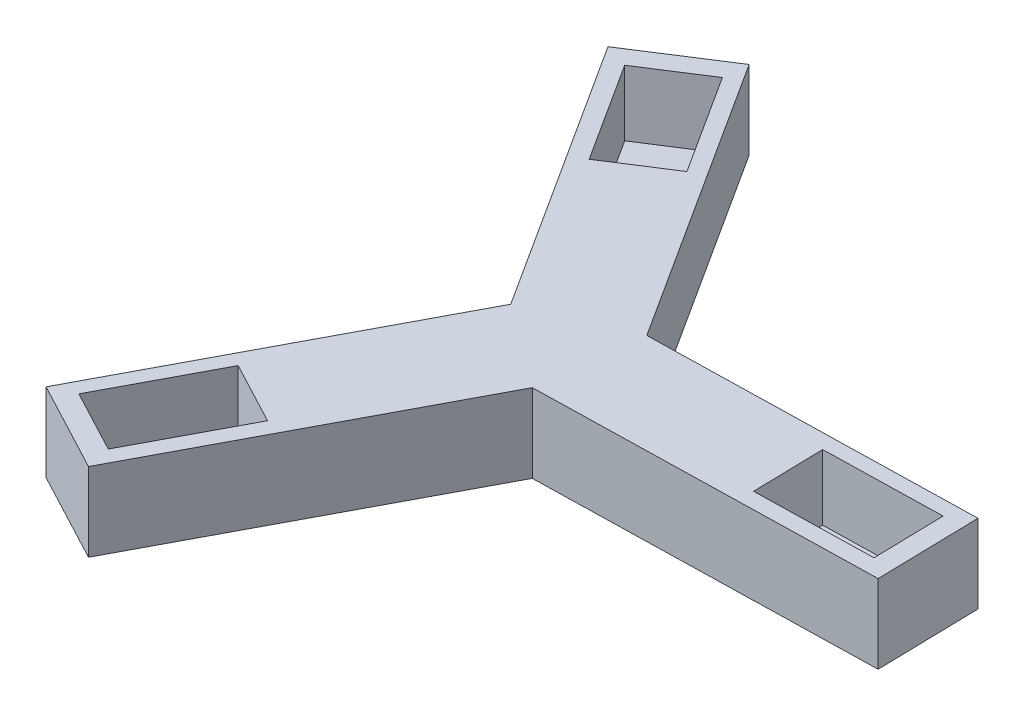
ISO-10303-21;
HEADER;
FILE_DESCRIPTION(('STEP AP214'),'2;1');
FILE_NAME('part.step','',(''),(''),'','','');
FILE_SCHEMA(('AUTOMOTIVE_DESIGN { 1 0 10303 214 1 1 1 1 }'));
ENDSEC;
DATA;
#1=APPLICATION_CONTEXT('core data for automotive mechanical design processes');
#2=APPLICATION_PROTOCOL_DEFINITION('international standard','automotive_design',2000,#1);
#3=PRODUCT_CONTEXT('',#1,'mechanical');
#4=PRODUCT('Part','Part','',(#3));
#5=PRODUCT_RELATED_PRODUCT_CATEGORY('part','',(#4));
#6=PRODUCT_DEFINITION_FORMATION('','',#4);
#7=PRODUCT_DEFINITION_CONTEXT('part definition',#1,'design');
#8=PRODUCT_DEFINITION('design','',#6,#7);
#9=PRODUCT_DEFINITION_SHAPE('','',#8);
#10=(LENGTH_UNIT() NAMED_UNIT(*) SI_UNIT(.MILLI.,.METRE.));
#11=(NAMED_UNIT(*) PLANE_ANGLE_UNIT() SI_UNIT($,.RADIAN.));
#12=(NAMED_UNIT(*) SI_UNIT($,.STERADIAN.) SOLID_ANGLE_UNIT());
#13=UNCERTAINTY_MEASURE_WITH_UNIT(LENGTH_MEASURE(1.E-05),#10,'distance_accuracy_value','');
#14=(GEOMETRIC_REPRESENTATION_CONTEXT(3) GLOBAL_UNCERTAINTY_ASSIGNED_CONTEXT((#13)) GLOBAL_UNIT_ASSIGNED_CONTEXT((#10,
#11,#12)) REPRESENTATION_CONTEXT('',''));
#15=CARTESIAN_POINT('',(0.,0.,0.));
#16=DIRECTION('',(0.,0.,1.));
#17=DIRECTION('',(1.,0.,0.));
#18=AXIS2_PLACEMENT_3D('',#15,#16,#17);
#19=CARTESIAN_POINT('',(-6.99882962270384,40.,4.49327331888505));
#20=DIRECTION('',(-0.841505066709778,0.,0.540249222768318));
#21=DIRECTION('',(0.540249222768318,0.,0.841505066709778));
#22=AXIS2_PLACEMENT_3D('',#19,#20,#21);
#23=PLANE('',#22);
#24=DIRECTION('',(-0.540249222768318,0.,-0.841505066709778));
#25=VECTOR('',#24,1.);
#26=CARTESIAN_POINT('',(-6.99882962270384,15.,4.49327331888505));
#27=LINE('',#26,#25);
#28=CARTESIAN_POINT('',(-29.7803936200412,15.,-30.9918337824235));
#29=VERTEX_POINT('',#28);
#30=CARTESIAN_POINT('',(-54.0916086446155,15.,-68.8595617843635));
#31=VERTEX_POINT('',#30);
#32=EDGE_CURVE('E61',#29,#31,#27,.T.);
#33=ORIENTED_EDGE('',*,*,#32,.F.);
#34=DIRECTION('',(0.,-1.,0.));
#35=VECTOR('',#34,1.);
#36=CARTESIAN_POINT('',(-29.7803936200412,40.,-30.9918337824235));
#37=LINE('',#36,#35);
#38=CARTESIAN_POINT('',(-29.7803936200412,40.,-30.9918337824235));
#39=VERTEX_POINT('',#38);
#40=EDGE_CURVE('E11',#39,#29,#37,.T.);
#41=ORIENTED_EDGE('',*,*,#40,.F.);
#42=DIRECTION('',(-0.540249222768318,0.,-0.841505066709778));
#43=VECTOR('',#42,1.);
#44=CARTESIAN_POINT('',(-6.99882962270384,40.,4.49327331888505));
#45=LINE('',#44,#43);
#46=CARTESIAN_POINT('',(-54.0916086446155,40.,-68.8595617843635));
#47=VERTEX_POINT('',#46);
#48=EDGE_CURVE('E289',#39,#47,#45,.T.);
#49=ORIENTED_EDGE('',*,*,#48,.T.);
#50=DIRECTION('',(0.,-1.,0.));
#51=VECTOR('',#50,1.);
#52=CARTESIAN_POINT('',(-54.0916086446155,40.,-68.8595617843635));
#53=LINE('',#52,#51);
#54=EDGE_CURVE('E247',#47,#31,#53,.T.);
#55=ORIENTED_EDGE('',*,*,#54,.T.);
#56=EDGE_LOOP('',(#33,#41,#49,#55));
#57=FACE_BOUND('',#56,.T.);
#58=ADVANCED_FACE('F36',(#57),#23,.T.);
#59=CARTESIAN_POINT('',(-22.7815639973374,40.,-35.4851071013085));
#60=DIRECTION('',(-0.540249222768318,0.,-0.841505066709778));
#61=DIRECTION('',(-0.841505066709778,0.,0.540249222768318));
#62=AXIS2_PLACEMENT_3D('',#59,#60,#61);
#63=PLANE('',#62);
#64=DIRECTION('',(0.841505066709778,0.,-0.540249222768318));
#65=VECTOR('',#64,1.);
#66=CARTESIAN_POINT('',(-22.7815639973374,15.,-35.4851071013085));
#67=LINE('',#66,#65);
#68=CARTESIAN_POINT('',(-52.5010304212052,15.,-16.4051047676789));
#69=VERTEX_POINT('',#68);
#70=EDGE_CURVE('E348',#69,#29,#67,.T.);
#71=ORIENTED_EDGE('',*,*,#70,.F.);
#72=DIRECTION('',(0.,-1.,0.));
#73=VECTOR('',#72,1.);
#74=CARTESIAN_POINT('',(-52.5010304212052,40.,-16.4051047676789));
#75=LINE('',#74,#73);
#76=CARTESIAN_POINT('',(-52.5010304212052,40.,-16.4051047676789));
#77=VERTEX_POINT('',#76);
#78=EDGE_CURVE('E45',#77,#69,#75,.T.);
#79=ORIENTED_EDGE('',*,*,#78,.F.);
#80=DIRECTION('',(0.841505066709778,0.,-0.540249222768318));
#81=VECTOR('',#80,1.);
#82=CARTESIAN_POINT('',(-22.7815639973374,40.,-35.4851071013085));
#83=LINE('',#82,#81);
#84=EDGE_CURVE('E286',#77,#39,#83,.T.);
#85=ORIENTED_EDGE('',*,*,#84,.T.);
#86=ORIENTED_EDGE('',*,*,#40,.T.);
#87=EDGE_LOOP('',(#71,#79,#85,#86));
#88=FACE_BOUND('',#87,.T.);
#89=ADVANCED_FACE('F374',(#88),#63,.T.);
#90=CARTESIAN_POINT('',(-29.7194664238679,40.,19.0800023336297));
#91=DIRECTION('',(-0.841505066709778,0.,0.540249222768318));
#92=DIRECTION('',(0.540249222768318,0.,0.841505066709778));
#93=AXIS2_PLACEMENT_3D('',#90,#91,#92);
#94=PLANE('',#93);
#95=ORIENTED_EDGE('',*,*,#78,.T.);
#96=DIRECTION('',(-0.540249222768318,0.,-0.841505066709778));
#97=VECTOR('',#96,1.);
#98=CARTESIAN_POINT('',(-29.7194664238679,15.,19.0800023336297));
#99=LINE('',#98,#97);
#100=CARTESIAN_POINT('',(-76.8122454457796,15.,-54.2728327696189));
#101=VERTEX_POINT('',#100);
#102=EDGE_CURVE('E342',#69,#101,#99,.T.);
#103=ORIENTED_EDGE('',*,*,#102,.T.);
#104=DIRECTION('',(0.,-1.,0.));
#105=VECTOR('',#104,1.);
#106=CARTESIAN_POINT('',(-76.8122454457796,40.,-54.2728327696189));
#107=LINE('',#106,#105);
#108=CARTESIAN_POINT('',(-76.8122454457796,40.,-54.2728327696189));
#109=VERTEX_POINT('',#108);
#110=EDGE_CURVE('E255',#109,#101,#107,.T.);
#111=ORIENTED_EDGE('',*,*,#110,.F.);
#112=DIRECTION('',(-0.540249222768318,0.,-0.841505066709778));
#113=VECTOR('',#112,1.);
#114=CARTESIAN_POINT('',(-29.7194664238679,40.,19.0800023336297));
#115=LINE('',#114,#113);
#116=EDGE_CURVE('E283',#77,#109,#115,.T.);
#117=ORIENTED_EDGE('',*,*,#116,.F.);
#118=EDGE_LOOP('',(#95,#103,#111,#117));
#119=FACE_BOUND('',#118,.T.);
#120=ADVANCED_FACE('F378',(#119),#94,.F.);
#121=CARTESIAN_POINT('',(9.04278221830663,40.,4.7851629635476));
#122=DIRECTION('',(0.883876510930576,0.,0.46772033676674));
#123=DIRECTION('',(0.46772033676674,0.,-0.883876510930576));
#124=AXIS2_PLACEMENT_3D('',#121,#122,#123);
#125=PLANE('',#124);
#126=DIRECTION('',(-0.46772033676674,0.,0.883876510930576));
#127=VECTOR('',#126,1.);
#128=CARTESIAN_POINT('',(9.04278221830663,15.,4.7851629635476));
#129=LINE('',#128,#127);
#130=CARTESIAN_POINT('',(-51.3043288347555,15.,118.826374707825));
#131=VERTEX_POINT('',#130);
#132=CARTESIAN_POINT('',(-72.3517439892587,15.,158.600817699701));
#133=VERTEX_POINT('',#132);
#134=EDGE_CURVE('E338',#131,#133,#129,.T.);
#135=ORIENTED_EDGE('',*,*,#134,.F.);
#136=DIRECTION('',(0.,-1.,0.));
#137=VECTOR('',#136,1.);
#138=CARTESIAN_POINT('',(-51.3043288347555,40.,118.826374707825));
#139=LINE('',#138,#137);
#140=CARTESIAN_POINT('',(-51.3043288347555,40.,118.826374707825));
#141=VERTEX_POINT('',#140);
#142=EDGE_CURVE('E244',#141,#131,#139,.T.);
#143=ORIENTED_EDGE('',*,*,#142,.F.);
#144=DIRECTION('',(-0.46772033676674,0.,0.883876510930576));
#145=VECTOR('',#144,1.);
#146=CARTESIAN_POINT('',(9.04278221830663,40.,4.7851629635476));
#147=LINE('',#146,#145);
#148=CARTESIAN_POINT('',(-72.3517439892587,40.,158.600817699701));
#149=VERTEX_POINT('',#148);
#150=EDGE_CURVE('E300',#141,#149,#147,.T.);
#151=ORIENTED_EDGE('',*,*,#150,.T.);
#152=DIRECTION('',(0.,-1.,0.));
#153=VECTOR('',#152,1.);
#154=CARTESIAN_POINT('',(-72.3517439892587,40.,158.600817699701));
#155=LINE('',#154,#153);
#156=EDGE_CURVE('E201',#149,#133,#155,.T.);
#157=ORIENTED_EDGE('',*,*,#156,.T.);
#158=EDGE_LOOP('',(#135,#143,#151,#157));
#159=FACE_BOUND('',#158,.T.);
#160=ADVANCED_FACE('F400',(#159),#125,.T.);
#161=CARTESIAN_POINT('',(-60.347111053062,40.,114.041211744277));
#162=DIRECTION('',(-0.467720336766739,0.,0.883876510930576));
#163=DIRECTION('',(0.883876510930576,0.,0.467720336766739));
#164=AXIS2_PLACEMENT_3D('',#161,#162,#163);
#165=PLANE('',#164);
#166=DIRECTION('',(-0.883876510930576,0.,-0.467720336766739));
#167=VECTOR('',#166,1.);
#168=CARTESIAN_POINT('',(-60.347111053062,15.,114.041211744277));
#169=LINE('',#168,#167);
#170=CARTESIAN_POINT('',(-27.4396630396299,15.,131.454823800527));
#171=VERTEX_POINT('',#170);
#172=EDGE_CURVE('E340',#171,#131,#169,.T.);
#173=ORIENTED_EDGE('',*,*,#172,.F.);
#174=DIRECTION('',(0.,-1.,0.));
#175=VECTOR('',#174,1.);
#176=CARTESIAN_POINT('',(-27.4396630396299,40.,131.454823800527));
#177=LINE('',#176,#175);
#178=CARTESIAN_POINT('',(-27.4396630396299,40.,131.454823800527));
#179=VERTEX_POINT('',#178);
#180=EDGE_CURVE('E248',#179,#171,#177,.T.);
#181=ORIENTED_EDGE('',*,*,#180,.F.);
#182=DIRECTION('',(-0.883876510930576,0.,-0.467720336766739));
#183=VECTOR('',#182,1.);
#184=CARTESIAN_POINT('',(-60.347111053062,40.,114.041211744277));
#185=LINE('',#184,#183);
#186=EDGE_CURVE('E297',#179,#141,#185,.T.);
#187=ORIENTED_EDGE('',*,*,#186,.T.);
#188=ORIENTED_EDGE('',*,*,#142,.T.);
#189=EDGE_LOOP('',(#173,#181,#187,#188));
#190=FACE_BOUND('',#189,.T.);
#191=ADVANCED_FACE('F396',(#190),#165,.T.);
#192=CARTESIAN_POINT('',(32.9074480134321,40.,17.4136120562495));
#193=DIRECTION('',(0.883876510930576,0.,0.467720336766739));
#194=DIRECTION('',(0.467720336766739,0.,-0.883876510930576));
#195=AXIS2_PLACEMENT_3D('',#192,#193,#194);
#196=PLANE('',#195);
#197=ORIENTED_EDGE('',*,*,#180,.T.);
#198=DIRECTION('',(-0.467720336766739,0.,0.883876510930576));
#199=VECTOR('',#198,1.);
#200=CARTESIAN_POINT('',(32.9074480134321,15.,17.4136120562495));
#201=LINE('',#200,#199);
#202=CARTESIAN_POINT('',(-48.4870781941332,15.,171.229266792403));
#203=VERTEX_POINT('',#202);
#204=EDGE_CURVE('E281',#171,#203,#201,.T.);
#205=ORIENTED_EDGE('',*,*,#204,.T.);
#206=DIRECTION('',(0.,-1.,0.));
#207=VECTOR('',#206,1.);
#208=CARTESIAN_POINT('',(-48.4870781941332,40.,171.229266792403));
#209=LINE('',#208,#207);
#210=CARTESIAN_POINT('',(-48.4870781941332,40.,171.229266792403));
#211=VERTEX_POINT('',#210);
#212=EDGE_CURVE('E205',#211,#203,#209,.T.);
#213=ORIENTED_EDGE('',*,*,#212,.F.);
#214=DIRECTION('',(-0.467720336766739,0.,0.883876510930576));
#215=VECTOR('',#214,1.);
#216=CARTESIAN_POINT('',(32.9074480134321,40.,17.4136120562495));
#217=LINE('',#216,#215);
#218=EDGE_CURVE('E294',#179,#211,#217,.T.);
#219=ORIENTED_EDGE('',*,*,#218,.F.);
#220=EDGE_LOOP('',(#197,#205,#213,#219));
#221=FACE_BOUND('',#220,.T.);
#222=ADVANCED_FACE('F393',(#221),#196,.F.);
#223=CARTESIAN_POINT('',(1.43920245325997,40.,63.9737406827199));
#224=DIRECTION('',(-0.0224910780984678,0.,-0.999747043709542));
#225=DIRECTION('',(-0.999747043709542,0.,0.0224910780984678));
#226=AXIS2_PLACEMENT_3D('',#223,#224,#225);
#227=PLANE('',#226);
#228=DIRECTION('',(0.999747043709542,0.,-0.0224910780984678));
#229=VECTOR('',#228,1.);
#230=CARTESIAN_POINT('',(1.43920245325997,15.,63.9737406827199));
#231=LINE('',#230,#229);
#232=CARTESIAN_POINT('',(88.664625708562,15.,62.0114505024681));
#233=VERTEX_POINT('',#232);
#234=CARTESIAN_POINT('',(133.653242675491,15.,60.9993519880371));
#235=VERTEX_POINT('',#234);
#236=EDGE_CURVE('E53',#233,#235,#231,.T.);
#237=ORIENTED_EDGE('',*,*,#236,.F.);
#238=DIRECTION('',(0.,-1.,0.));
#239=VECTOR('',#238,1.);
#240=CARTESIAN_POINT('',(88.664625708562,40.,62.0114505024681));
#241=LINE('',#240,#239);
#242=CARTESIAN_POINT('',(88.664625708562,40.,62.0114505024681));
#243=VERTEX_POINT('',#242);
#244=EDGE_CURVE('E191',#243,#233,#241,.T.);
#245=ORIENTED_EDGE('',*,*,#244,.F.);
#246=DIRECTION('',(0.999747043709542,0.,-0.0224910780984678));
#247=VECTOR('',#246,1.);
#248=CARTESIAN_POINT('',(1.43920245325997,40.,63.9737406827199));
#249=LINE('',#248,#247);
#250=CARTESIAN_POINT('',(133.653242675491,40.,60.9993519880371));
#251=VERTEX_POINT('',#250);
#252=EDGE_CURVE('E309',#243,#251,#249,.T.);
#253=ORIENTED_EDGE('',*,*,#252,.T.);
#254=DIRECTION('',(0.,-1.,0.));
#255=VECTOR('',#254,1.);
#256=CARTESIAN_POINT('',(133.653242675491,40.,60.9993519880371));
#257=LINE('',#256,#255);
#258=EDGE_CURVE('E194',#251,#235,#257,.T.);
#259=ORIENTED_EDGE('',*,*,#258,.T.);
#260=EDGE_LOOP('',(#237,#245,#253,#259));
#261=FACE_BOUND('',#260,.T.);
#262=ADVANCED_FACE('F189',(#261),#227,.T.);
#263=CARTESIAN_POINT('',(87.225423255302,40.,-1.96229018025168));
#264=DIRECTION('',(0.999747043709542,0.,-0.0224910780984675));
#265=DIRECTION('',(-0.0224910780984675,0.,-0.999747043709542));
#266=AXIS2_PLACEMENT_3D('',#263,#264,#265);
#267=PLANE('',#266);
#268=DIRECTION('',(0.0224910780984675,0.,0.999747043709542));
#269=VECTOR('',#268,1.);
#270=CARTESIAN_POINT('',(87.225423255302,15.,-1.96229018025168));
#271=LINE('',#270,#269);
#272=CARTESIAN_POINT('',(88.0573665999033,15.,35.0182803223105));
#273=VERTEX_POINT('',#272);
#274=EDGE_CURVE('E179',#273,#233,#271,.T.);
#275=ORIENTED_EDGE('',*,*,#274,.F.);
#276=DIRECTION('',(0.,-1.,0.));
#277=VECTOR('',#276,1.);
#278=CARTESIAN_POINT('',(88.0573665999033,40.,35.0182803223105));
#279=LINE('',#278,#277);
#280=CARTESIAN_POINT('',(88.0573665999033,40.,35.0182803223105));
#281=VERTEX_POINT('',#280);
#282=EDGE_CURVE('E202',#281,#273,#279,.T.);
#283=ORIENTED_EDGE('',*,*,#282,.F.);
#284=DIRECTION('',(0.0224910780984675,0.,0.999747043709542));
#285=VECTOR('',#284,1.);
#286=CARTESIAN_POINT('',(87.225423255302,40.,-1.96229018025168));
#287=LINE('',#286,#285);
#288=EDGE_CURVE('E200',#281,#243,#287,.T.);
#289=ORIENTED_EDGE('',*,*,#288,.T.);
#290=ORIENTED_EDGE('',*,*,#244,.T.);
#291=EDGE_LOOP('',(#275,#283,#289,#290));
#292=FACE_BOUND('',#291,.T.);
#293=ADVANCED_FACE('F198',(#292),#267,.T.);
#294=CARTESIAN_POINT('',(0.831943344601324,40.,36.9805705025622));
#295=DIRECTION('',(-0.0224910780984673,0.,-0.999747043709542));
#296=DIRECTION('',(-0.999747043709542,0.,0.0224910780984673));
#297=AXIS2_PLACEMENT_3D('',#294,#295,#296);
#298=PLANE('',#297);
#299=ORIENTED_EDGE('',*,*,#282,.T.);
#300=DIRECTION('',(0.999747043709542,0.,-0.0224910780984673));
#301=VECTOR('',#300,1.);
#302=CARTESIAN_POINT('',(0.831943344601324,15.,36.9805705025622));
#303=LINE('',#302,#301);
#304=CARTESIAN_POINT('',(133.045983566833,15.,34.0061818078795));
#305=VERTEX_POINT('',#304);
#306=EDGE_CURVE('E182',#273,#305,#303,.T.);
#307=ORIENTED_EDGE('',*,*,#306,.T.);
#308=DIRECTION('',(0.,-1.,0.));
#309=VECTOR('',#308,1.);
#310=CARTESIAN_POINT('',(133.045983566833,40.,34.0061818078795));
#311=LINE('',#310,#309);
#312=CARTESIAN_POINT('',(133.045983566833,40.,34.0061818078795));
#313=VERTEX_POINT('',#312);
#314=EDGE_CURVE('E207',#313,#305,#311,.T.);
#315=ORIENTED_EDGE('',*,*,#314,.F.);
#316=DIRECTION('',(0.999747043709542,0.,-0.0224910780984673));
#317=VECTOR('',#316,1.);
#318=CARTESIAN_POINT('',(0.831943344601324,40.,36.9805705025622));
#319=LINE('',#318,#317);
#320=EDGE_CURVE('E305',#281,#313,#319,.T.);
#321=ORIENTED_EDGE('',*,*,#320,.F.);
#322=EDGE_LOOP('',(#299,#307,#315,#321));
#323=FACE_BOUND('',#322,.T.);
#324=ADVANCED_FACE('F355',(#323),#298,.F.);
#325=CARTESIAN_POINT('',(0.702397708267025,40.,31.2221597059045));
#326=DIRECTION('',(-0.0224910780984673,0.,-0.999747043709542));
#327=DIRECTION('',(-0.999747043709542,0.,0.0224910780984673));
#328=AXIS2_PLACEMENT_3D('',#325,#326,#327);
#329=PLANE('',#328);
#330=DIRECTION('',(0.999747043709542,0.,-0.0224910780984673));
#331=VECTOR('',#330,1.);
#332=CARTESIAN_POINT('',(0.702397708267025,10.,31.2221597059045));
#333=LINE('',#332,#331);
#334=CARTESIAN_POINT('',(16.7622523157272,10.,30.860864869877));
#335=VERTEX_POINT('',#334);
#336=CARTESIAN_POINT('',(140.429718135747,10.,28.0787464835323));
#337=VERTEX_POINT('',#336);
#338=EDGE_CURVE('E279',#335,#337,#333,.T.);
#339=ORIENTED_EDGE('',*,*,#338,.F.);
#340=DIRECTION('',(0.,-1.,0.));
#341=VECTOR('',#340,1.);
#342=CARTESIAN_POINT('',(16.7622523157272,40.,30.860864869877));
#343=LINE('',#342,#341);
#344=CARTESIAN_POINT('',(16.7622523157272,40.,30.860864869877));
#345=VERTEX_POINT('',#344);
#346=EDGE_CURVE('E40',#345,#335,#343,.T.);
#347=ORIENTED_EDGE('',*,*,#346,.F.);
#348=DIRECTION('',(0.999747043709542,0.,-0.0224910780984673));
#349=VECTOR('',#348,1.);
#350=CARTESIAN_POINT('',(0.702397708267025,40.,31.2221597059045));
#351=LINE('',#350,#349);
#352=CARTESIAN_POINT('',(140.429718135747,40.,28.0787464835323));
#353=VERTEX_POINT('',#352);
#354=EDGE_CURVE('E262',#345,#353,#351,.T.);
#355=ORIENTED_EDGE('',*,*,#354,.T.);
#356=DIRECTION('',(0.,-1.,0.));
#357=VECTOR('',#356,1.);
#358=CARTESIAN_POINT('',(140.429718135747,40.,28.0787464835323));
#359=LINE('',#358,#357);
#360=EDGE_CURVE('E211',#353,#337,#359,.T.);
#361=ORIENTED_EDGE('',*,*,#360,.T.);
#362=EDGE_LOOP('',(#339,#347,#355,#361));
#363=FACE_BOUND('',#362,.T.);
#364=ADVANCED_FACE('F38',(#363),#329,.T.);
#365=CARTESIAN_POINT('',(-2.16017548912262,40.,1.38684028796723));
#366=DIRECTION('',(0.841505066709778,0.,-0.540249222768318));
#367=DIRECTION('',(-0.540249222768318,0.,-0.841505066709778));
#368=AXIS2_PLACEMENT_3D('',#365,#366,#367);
#369=PLANE('',#368);
#370=DIRECTION('',(0.540249222768318,0.,0.841505066709778));
#371=VECTOR('',#370,1.);
#372=CARTESIAN_POINT('',(-2.16017548912262,10.,1.38684028796723));
#373=LINE('',#372,#371);
#374=CARTESIAN_POINT('',(-53.3048236817967,10.,-78.2772828156047));
#375=VERTEX_POINT('',#374);
#376=EDGE_CURVE('E277',#375,#335,#373,.T.);
#377=ORIENTED_EDGE('',*,*,#376,.F.);
#378=DIRECTION('',(0.,-1.,0.));
#379=VECTOR('',#378,1.);
#380=CARTESIAN_POINT('',(-53.3048236817967,40.,-78.2772828156047));
#381=LINE('',#380,#379);
#382=CARTESIAN_POINT('',(-53.3048236817967,40.,-78.2772828156047));
#383=VERTEX_POINT('',#382);
#384=EDGE_CURVE('E232',#383,#375,#381,.T.);
#385=ORIENTED_EDGE('',*,*,#384,.F.);
#386=DIRECTION('',(0.540249222768318,0.,0.841505066709778));
#387=VECTOR('',#386,1.);
#388=CARTESIAN_POINT('',(-2.16017548912262,40.,1.38684028796723));
#389=LINE('',#388,#387);
#390=EDGE_CURVE('E329',#383,#345,#389,.T.);
#391=ORIENTED_EDGE('',*,*,#390,.T.);
#392=ORIENTED_EDGE('',*,*,#346,.T.);
#393=EDGE_LOOP('',(#377,#385,#391,#392));
#394=FACE_BOUND('',#393,.T.);
#395=ADVANCED_FACE('F438',(#394),#369,.T.);
#396=CARTESIAN_POINT('',(-51.1446481926741,40.,-79.6641231035719));
#397=DIRECTION('',(-0.540249222768318,0.,-0.841505066709778));
#398=DIRECTION('',(-0.841505066709778,0.,0.540249222768318));
#399=AXIS2_PLACEMENT_3D('',#396,#397,#398);
#400=PLANE('',#399);
#401=DIRECTION('',(0.841505066709778,0.,-0.540249222768318));
#402=VECTOR('',#401,1.);
#403=CARTESIAN_POINT('',(-51.1446481926741,10.,-79.6641231035719));
#404=LINE('',#403,#402);
#405=CARTESIAN_POINT('',(-86.1235212834775,10.,-57.2075631276402));
#406=VERTEX_POINT('',#405);
#407=EDGE_CURVE('E275',#406,#375,#404,.T.);
#408=ORIENTED_EDGE('',*,*,#407,.F.);
#409=DIRECTION('',(0.,-1.,0.));
#410=VECTOR('',#409,1.);
#411=CARTESIAN_POINT('',(-86.1235212834781,40.,-57.2075631276402));
#412=LINE('',#411,#410);
#413=CARTESIAN_POINT('',(-86.1235212834781,40.,-57.2075631276402));
#414=VERTEX_POINT('',#413);
#415=EDGE_CURVE('E230',#414,#406,#412,.T.);
#416=ORIENTED_EDGE('',*,*,#415,.F.);
#417=DIRECTION('',(0.841505066709778,0.,-0.540249222768318));
#418=VECTOR('',#417,1.);
#419=CARTESIAN_POINT('',(-51.1446481926741,40.,-79.6641231035719));
#420=LINE('',#419,#418);
#421=EDGE_CURVE('E327',#414,#383,#420,.T.);
#422=ORIENTED_EDGE('',*,*,#421,.T.);
#423=ORIENTED_EDGE('',*,*,#384,.T.);
#424=EDGE_LOOP('',(#408,#416,#422,#423));
#425=FACE_BOUND('',#424,.T.);
#426=ADVANCED_FACE('F435',(#425),#400,.T.);
#427=CARTESIAN_POINT('',(-34.9788730908044,40.,22.4565599759315));
#428=DIRECTION('',(0.841505066709782,0.,-0.540249222768312));
#429=DIRECTION('',(-0.540249222768312,0.,-0.841505066709782));
#430=AXIS2_PLACEMENT_3D('',#427,#428,#429);
#431=PLANE('',#430);
#432=DIRECTION('',(0.540249222768312,0.,0.841505066709782));
#433=VECTOR('',#432,1.);
#434=CARTESIAN_POINT('',(-34.9788730908044,10.,22.4565599759315));
#435=LINE('',#434,#433);
#436=CARTESIAN_POINT('',(-19.5395908979559,10.,46.5051539286819));
#437=VERTEX_POINT('',#436);
#438=EDGE_CURVE('E272',#406,#437,#435,.T.);
#439=ORIENTED_EDGE('',*,*,#438,.T.);
#440=DIRECTION('',(0.,-1.,0.));
#441=VECTOR('',#440,1.);
#442=CARTESIAN_POINT('',(-19.5395908979559,40.,46.5051539286819));
#443=LINE('',#442,#441);
#444=CARTESIAN_POINT('',(-19.5395908979559,40.,46.5051539286819));
#445=VERTEX_POINT('',#444);
#446=EDGE_CURVE('E227',#445,#437,#443,.T.);
#447=ORIENTED_EDGE('',*,*,#446,.F.);
#448=DIRECTION('',(0.540249222768312,0.,0.841505066709782));
#449=VECTOR('',#448,1.);
#450=CARTESIAN_POINT('',(-34.9788730908044,40.,22.4565599759315));
#451=LINE('',#450,#449);
#452=EDGE_CURVE('E325',#414,#445,#451,.T.);
#453=ORIENTED_EDGE('',*,*,#452,.F.);
#454=ORIENTED_EDGE('',*,*,#415,.T.);
#455=EDGE_LOOP('',(#439,#447,#453,#454));
#456=FACE_BOUND('',#455,.T.);
#457=ADVANCED_FACE('F431',(#456),#431,.F.);
#458=CARTESIAN_POINT('',(3.96049228045575,40.,2.0957710271388));
#459=DIRECTION('',(-0.883876510930576,0.,-0.467720336766739));
#460=DIRECTION('',(-0.467720336766739,0.,0.883876510930576));
#461=AXIS2_PLACEMENT_3D('',#458,#459,#460);
#462=PLANE('',#461);
#463=DIRECTION('',(0.467720336766739,0.,-0.883876510930576));
#464=VECTOR('',#463,1.);
#465=CARTESIAN_POINT('',(3.96049228045575,10.,2.0957710271388));
#466=LINE('',#465,#464);
#467=CARTESIAN_POINT('',(-80.9419364528601,10.,162.540499595272));
#468=VERTEX_POINT('',#467);
#469=EDGE_CURVE('E270',#468,#437,#466,.T.);
#470=ORIENTED_EDGE('',*,*,#469,.F.);
#471=DIRECTION('',(0.,-1.,0.));
#472=VECTOR('',#471,1.);
#473=CARTESIAN_POINT('',(-80.9419364528601,40.,162.540499595271));
#474=LINE('',#473,#472);
#475=CARTESIAN_POINT('',(-80.9419364528601,40.,162.540499595271));
#476=VERTEX_POINT('',#475);
#477=EDGE_CURVE('E224',#476,#468,#474,.T.);
#478=ORIENTED_EDGE('',*,*,#477,.F.);
#479=DIRECTION('',(0.467720336766739,0.,-0.883876510930576));
#480=VECTOR('',#479,1.);
#481=CARTESIAN_POINT('',(3.96049228045575,40.,2.0957710271388));
#482=LINE('',#481,#480);
#483=EDGE_CURVE('E322',#476,#445,#482,.T.);
#484=ORIENTED_EDGE('',*,*,#483,.T.);
#485=ORIENTED_EDGE('',*,*,#446,.T.);
#486=EDGE_LOOP('',(#470,#478,#484,#485));
#487=FACE_BOUND('',#486,.T.);
#488=ADVANCED_FACE('F427',(#487),#462,.T.);
#489=CARTESIAN_POINT('',(-84.9024287333158,40.,160.444728568133));
#490=DIRECTION('',(-0.467720336766739,0.,0.883876510930576));
#491=DIRECTION('',(0.883876510930576,0.,0.467720336766739));
#492=AXIS2_PLACEMENT_3D('',#489,#490,#491);
#493=PLANE('',#492);
#494=DIRECTION('',(-0.883876510930576,0.,-0.467720336766739));
#495=VECTOR('',#494,1.);
#496=CARTESIAN_POINT('',(-84.9024287333158,10.,160.444728568133));
#497=LINE('',#496,#495);
#498=CARTESIAN_POINT('',(-46.4707525265681,10.,180.781592729174));
#499=VERTEX_POINT('',#498);
#500=EDGE_CURVE('E268',#499,#468,#497,.T.);
#501=ORIENTED_EDGE('',*,*,#500,.F.);
#502=DIRECTION('',(0.,-1.,0.));
#503=VECTOR('',#502,1.);
#504=CARTESIAN_POINT('',(-46.4707525265676,40.,180.781592729174));
#505=LINE('',#504,#503);
#506=CARTESIAN_POINT('',(-46.4707525265676,40.,180.781592729174));
#507=VERTEX_POINT('',#506);
#508=EDGE_CURVE('E221',#507,#499,#505,.T.);
#509=ORIENTED_EDGE('',*,*,#508,.F.);
#510=DIRECTION('',(-0.883876510930576,0.,-0.467720336766739));
#511=VECTOR('',#510,1.);
#512=CARTESIAN_POINT('',(-84.9024287333158,40.,160.444728568133));
#513=LINE('',#512,#511);
#514=EDGE_CURVE('E319',#507,#476,#513,.T.);
#515=ORIENTED_EDGE('',*,*,#514,.T.);
#516=ORIENTED_EDGE('',*,*,#477,.T.);
#517=EDGE_LOOP('',(#501,#509,#515,#516));
#518=FACE_BOUND('',#517,.T.);
#519=ADVANCED_FACE('F423',(#518),#493,.T.);
#520=CARTESIAN_POINT('',(38.4316762067488,40.,20.3368641610423));
#521=DIRECTION('',(-0.883876510930572,0.,-0.467720336766746));
#522=DIRECTION('',(-0.467720336766746,0.,0.883876510930573));
#523=AXIS2_PLACEMENT_3D('',#520,#521,#522);
#524=PLANE('',#523);
#525=DIRECTION('',(0.467720336766746,0.,-0.883876510930572));
#526=VECTOR('',#525,1.);
#527=CARTESIAN_POINT('',(38.4316762067488,10.,20.3368641610423));
#528=LINE('',#527,#526);
#529=CARTESIAN_POINT('',(12.1598597463835,10.,69.9841419110722));
#530=VERTEX_POINT('',#529);
#531=EDGE_CURVE('E265',#499,#530,#528,.T.);
#532=ORIENTED_EDGE('',*,*,#531,.T.);
#533=DIRECTION('',(0.,-1.,0.));
#534=VECTOR('',#533,1.);
#535=CARTESIAN_POINT('',(12.1598597463835,40.,69.9841419110721));
#536=LINE('',#535,#534);
#537=CARTESIAN_POINT('',(12.1598597463835,40.,69.9841419110721));
#538=VERTEX_POINT('',#537);
#539=EDGE_CURVE('E218',#538,#530,#536,.T.);
#540=ORIENTED_EDGE('',*,*,#539,.F.);
#541=DIRECTION('',(0.467720336766746,0.,-0.883876510930572));
#542=VECTOR('',#541,1.);
#543=CARTESIAN_POINT('',(38.4316762067488,40.,20.3368641610423));
#544=LINE('',#543,#542);
#545=EDGE_CURVE('E317',#507,#538,#544,.T.);
#546=ORIENTED_EDGE('',*,*,#545,.F.);
#547=ORIENTED_EDGE('',*,*,#508,.T.);
#548=EDGE_LOOP('',(#532,#540,#546,#547));
#549=FACE_BOUND('',#548,.T.);
#550=ADVANCED_FACE('F419',(#549),#524,.F.);
#551=CARTESIAN_POINT('',(1.57977169137537,40.,70.2221597059045));
#552=DIRECTION('',(0.0224910780984674,0.,0.999747043709542));
#553=DIRECTION('',(0.999747043709542,0.,-0.0224910780984674));
#554=AXIS2_PLACEMENT_3D('',#551,#552,#553);
#555=PLANE('',#554);
#556=DIRECTION('',(-0.999747043709542,0.,0.0224910780984674));
#557=VECTOR('',#556,1.);
#558=CARTESIAN_POINT('',(1.57977169137537,10.,70.2221597059045));
#559=LINE('',#558,#557);
#560=CARTESIAN_POINT('',(141.307092118856,10.,67.0787464835323));
#561=VERTEX_POINT('',#560);
#562=EDGE_CURVE('E263',#561,#530,#559,.T.);
#563=ORIENTED_EDGE('',*,*,#562,.F.);
#564=DIRECTION('',(0.,-1.,0.));
#565=VECTOR('',#564,1.);
#566=CARTESIAN_POINT('',(141.307092118856,40.,67.0787464835323));
#567=LINE('',#566,#565);
#568=CARTESIAN_POINT('',(141.307092118856,40.,67.0787464835323));
#569=VERTEX_POINT('',#568);
#570=EDGE_CURVE('E214',#569,#561,#567,.T.);
#571=ORIENTED_EDGE('',*,*,#570,.F.);
#572=DIRECTION('',(-0.999747043709542,0.,0.0224910780984674));
#573=VECTOR('',#572,1.);
#574=CARTESIAN_POINT('',(1.57977169137537,40.,70.2221597059045));
#575=LINE('',#574,#573);
#576=EDGE_CURVE('E314',#569,#538,#575,.T.);
#577=ORIENTED_EDGE('',*,*,#576,.T.);
#578=ORIENTED_EDGE('',*,*,#539,.T.);
#579=EDGE_LOOP('',(#563,#571,#577,#578));
#580=FACE_BOUND('',#579,.T.);
#581=ADVANCED_FACE('F391',(#580),#555,.T.);
#582=CARTESIAN_POINT('',(-81.3945262075654,40.,153.815654736153));
#583=DIRECTION('',(-0.46772033676674,0.,0.883876510930576));
#584=DIRECTION('',(0.883876510930576,0.,0.46772033676674));
#585=AXIS2_PLACEMENT_3D('',#582,#583,#584);
#586=PLANE('',#585);
#587=ORIENTED_EDGE('',*,*,#212,.T.);
#588=DIRECTION('',(-0.883876510930576,0.,-0.46772033676674));
#589=VECTOR('',#588,1.);
#590=CARTESIAN_POINT('',(-81.3945262075654,15.,153.815654736153));
#591=LINE('',#590,#589);
#592=EDGE_CURVE('E335',#203,#133,#591,.T.);
#593=ORIENTED_EDGE('',*,*,#592,.T.);
#594=ORIENTED_EDGE('',*,*,#156,.F.);
#595=DIRECTION('',(-0.883876510930576,0.,-0.46772033676674));
#596=VECTOR('',#595,1.);
#597=CARTESIAN_POINT('',(-81.3945262075654,40.,153.815654736153));
#598=LINE('',#597,#596);
#599=EDGE_CURVE('E292',#211,#149,#598,.T.);
#600=ORIENTED_EDGE('',*,*,#599,.F.);
#601=EDGE_LOOP('',(#587,#593,#594,#600));
#602=FACE_BOUND('',#601,.T.);
#603=ADVANCED_FACE('F388',(#602),#586,.F.);
#604=CARTESIAN_POINT('',(132.214040222231,40.,-2.97438869468265));
#605=DIRECTION('',(0.999747043709542,0.,-0.022491078098467));
#606=DIRECTION('',(-0.022491078098467,0.,-0.999747043709542));
#607=AXIS2_PLACEMENT_3D('',#604,#605,#606);
#608=PLANE('',#607);
#609=ORIENTED_EDGE('',*,*,#314,.T.);
#610=DIRECTION('',(0.022491078098467,0.,0.999747043709542));
#611=VECTOR('',#610,1.);
#612=CARTESIAN_POINT('',(132.214040222231,15.,-2.97438869468265));
#613=LINE('',#612,#611);
#614=EDGE_CURVE('E195',#305,#235,#613,.T.);
#615=ORIENTED_EDGE('',*,*,#614,.T.);
#616=ORIENTED_EDGE('',*,*,#258,.F.);
#617=DIRECTION('',(0.022491078098467,0.,0.999747043709542));
#618=VECTOR('',#617,1.);
#619=CARTESIAN_POINT('',(132.214040222231,40.,-2.97438869468265));
#620=LINE('',#619,#618);
#621=EDGE_CURVE('E303',#313,#251,#620,.T.);
#622=ORIENTED_EDGE('',*,*,#621,.F.);
#623=EDGE_LOOP('',(#609,#615,#616,#622));
#624=FACE_BOUND('',#623,.T.);
#625=ADVANCED_FACE('F352',(#624),#608,.F.);
#626=CARTESIAN_POINT('',(139.72732042748,40.,-3.14341322237222));
#627=DIRECTION('',(0.999747043709542,0.,-0.0224910780984679));
#628=DIRECTION('',(-0.0224910780984679,0.,-0.999747043709542));
#629=AXIS2_PLACEMENT_3D('',#626,#627,#628);
#630=PLANE('',#629);
#631=DIRECTION('',(0.0224910780984679,0.,0.999747043709542));
#632=VECTOR('',#631,1.);
#633=CARTESIAN_POINT('',(139.72732042748,10.,-3.14341322237222));
#634=LINE('',#633,#632);
#635=EDGE_CURVE('E260',#337,#561,#634,.T.);
#636=ORIENTED_EDGE('',*,*,#635,.F.);
#637=ORIENTED_EDGE('',*,*,#360,.F.);
#638=DIRECTION('',(0.0224910780984679,0.,0.999747043709542));
#639=VECTOR('',#638,1.);
#640=CARTESIAN_POINT('',(139.72732042748,40.,-3.14341322237222));
#641=LINE('',#640,#639);
#642=EDGE_CURVE('E311',#353,#569,#641,.T.);
#643=ORIENTED_EDGE('',*,*,#642,.T.);
#644=ORIENTED_EDGE('',*,*,#570,.T.);
#645=EDGE_LOOP('',(#636,#637,#643,#644));
#646=FACE_BOUND('',#645,.T.);
#647=ADVANCED_FACE('F407',(#646),#630,.T.);
#648=CARTESIAN_POINT('',(-47.0927790219117,40.,-73.3528351032486));
#649=DIRECTION('',(-0.540249222768318,0.,-0.841505066709778));
#650=DIRECTION('',(-0.841505066709778,0.,0.540249222768318));
#651=AXIS2_PLACEMENT_3D('',#648,#649,#650);
#652=PLANE('',#651);
#653=ORIENTED_EDGE('',*,*,#110,.T.);
#654=DIRECTION('',(0.841505066709778,0.,-0.540249222768318));
#655=VECTOR('',#654,1.);
#656=CARTESIAN_POINT('',(-47.0927790219117,15.,-73.3528351032486));
#657=LINE('',#656,#655);
#658=EDGE_CURVE('E345',#101,#31,#657,.T.);
#659=ORIENTED_EDGE('',*,*,#658,.T.);
#660=ORIENTED_EDGE('',*,*,#54,.F.);
#661=DIRECTION('',(0.841505066709778,0.,-0.540249222768318));
#662=VECTOR('',#661,1.);
#663=CARTESIAN_POINT('',(-47.0927790219117,40.,-73.3528351032486));
#664=LINE('',#663,#662);
#665=EDGE_CURVE('E215',#109,#47,#664,.T.);
#666=ORIENTED_EDGE('',*,*,#665,.F.);
#667=EDGE_LOOP('',(#653,#659,#660,#666));
#668=FACE_BOUND('',#667,.T.);
#669=ADVANCED_FACE('F362',(#668),#652,.F.);
#670=CARTESIAN_POINT('',(0.,40.,0.));
#671=DIRECTION('',(0.,1.,0.));
#672=DIRECTION('',(0.,0.,1.));
#673=AXIS2_PLACEMENT_3D('',#670,#671,#672);
#674=PLANE('',#673);
#675=ORIENTED_EDGE('',*,*,#354,.F.);
#676=ORIENTED_EDGE('',*,*,#390,.F.);
#677=ORIENTED_EDGE('',*,*,#421,.F.);
#678=ORIENTED_EDGE('',*,*,#452,.T.);
#679=ORIENTED_EDGE('',*,*,#483,.F.);
#680=ORIENTED_EDGE('',*,*,#514,.F.);
#681=ORIENTED_EDGE('',*,*,#545,.T.);
#682=ORIENTED_EDGE('',*,*,#576,.F.);
#683=ORIENTED_EDGE('',*,*,#642,.F.);
#684=EDGE_LOOP('',(#675,#676,#677,#678,#679,#680,#681,#682,#683));
#685=FACE_BOUND('',#684,.T.);
#686=ORIENTED_EDGE('',*,*,#252,.F.);
#687=ORIENTED_EDGE('',*,*,#288,.F.);
#688=ORIENTED_EDGE('',*,*,#320,.T.);
#689=ORIENTED_EDGE('',*,*,#621,.T.);
#690=EDGE_LOOP('',(#686,#687,#688,#689));
#691=FACE_BOUND('',#690,.T.);
#692=ORIENTED_EDGE('',*,*,#150,.F.);
#693=ORIENTED_EDGE('',*,*,#186,.F.);
#694=ORIENTED_EDGE('',*,*,#218,.T.);
#695=ORIENTED_EDGE('',*,*,#599,.T.);
#696=EDGE_LOOP('',(#692,#693,#694,#695));
#697=FACE_BOUND('',#696,.T.);
#698=ORIENTED_EDGE('',*,*,#48,.F.);
#699=ORIENTED_EDGE('',*,*,#84,.F.);
#700=ORIENTED_EDGE('',*,*,#116,.T.);
#701=ORIENTED_EDGE('',*,*,#665,.T.);
#702=EDGE_LOOP('',(#698,#699,#700,#701));
#703=FACE_BOUND('',#702,.T.);
#704=ADVANCED_FACE('F358',(#685,#691,#697,#703),#674,.T.);
#705=CARTESIAN_POINT('',(0.,10.,0.));
#706=DIRECTION('',(0.,1.,0.));
#707=DIRECTION('',(0.,0.,1.));
#708=AXIS2_PLACEMENT_3D('',#705,#706,#707);
#709=PLANE('',#708);
#710=ORIENTED_EDGE('',*,*,#338,.T.);
#711=ORIENTED_EDGE('',*,*,#635,.T.);
#712=ORIENTED_EDGE('',*,*,#562,.T.);
#713=ORIENTED_EDGE('',*,*,#531,.F.);
#714=ORIENTED_EDGE('',*,*,#500,.T.);
#715=ORIENTED_EDGE('',*,*,#469,.T.);
#716=ORIENTED_EDGE('',*,*,#438,.F.);
#717=ORIENTED_EDGE('',*,*,#407,.T.);
#718=ORIENTED_EDGE('',*,*,#376,.T.);
#719=EDGE_LOOP('',(#710,#711,#712,#713,#714,#715,#716,#717,#718));
#720=FACE_BOUND('',#719,.T.);
#721=ADVANCED_FACE('F361',(#720),#709,.F.);
#722=CARTESIAN_POINT('',(0.,15.,0.));
#723=DIRECTION('',(0.,1.,0.));
#724=DIRECTION('',(0.,0.,1.));
#725=AXIS2_PLACEMENT_3D('',#722,#723,#724);
#726=PLANE('',#725);
#727=ORIENTED_EDGE('',*,*,#172,.T.);
#728=ORIENTED_EDGE('',*,*,#134,.T.);
#729=ORIENTED_EDGE('',*,*,#592,.F.);
#730=ORIENTED_EDGE('',*,*,#204,.F.);
#731=EDGE_LOOP('',(#727,#728,#729,#730));
#732=FACE_BOUND('',#731,.T.);
#733=ADVANCED_FACE('F462',(#732),#726,.T.);
#734=CARTESIAN_POINT('',(0.,15.,0.));
#735=DIRECTION('',(0.,1.,0.));
#736=DIRECTION('',(0.,0.,1.));
#737=AXIS2_PLACEMENT_3D('',#734,#735,#736);
#738=PLANE('',#737);
#739=ORIENTED_EDGE('',*,*,#70,.T.);
#740=ORIENTED_EDGE('',*,*,#32,.T.);
#741=ORIENTED_EDGE('',*,*,#658,.F.);
#742=ORIENTED_EDGE('',*,*,#102,.F.);
#743=EDGE_LOOP('',(#739,#740,#741,#742));
#744=FACE_BOUND('',#743,.T.);
#745=ADVANCED_FACE('F467',(#744),#738,.T.);
#746=CARTESIAN_POINT('',(0.,15.,0.));
#747=DIRECTION('',(0.,1.,0.));
#748=DIRECTION('',(0.,0.,1.));
#749=AXIS2_PLACEMENT_3D('',#746,#747,#748);
#750=PLANE('',#749);
#751=ORIENTED_EDGE('',*,*,#274,.T.);
#752=ORIENTED_EDGE('',*,*,#236,.T.);
#753=ORIENTED_EDGE('',*,*,#614,.F.);
#754=ORIENTED_EDGE('',*,*,#306,.F.);
#755=EDGE_LOOP('',(#751,#752,#753,#754));
#756=FACE_BOUND('',#755,.T.);
#757=ADVANCED_FACE('F180',(#756),#750,.T.);
#758=CLOSED_SHELL('',(#58,#89,#120,#160,#191,#222,#262,#293,#324,#364,#395,#426,#457,#488,#519,
#550,#581,#603,#625,#647,#669,#704,#721,#733,#745,#757));
#759=MANIFOLD_SOLID_BREP('B2',#758);
#760=ADVANCED_BREP_SHAPE_REPRESENTATION('',(#18,#759),#14);
#761=SHAPE_DEFINITION_REPRESENTATION(#9,#760);
ENDSEC;
END-ISO-10303-21;
